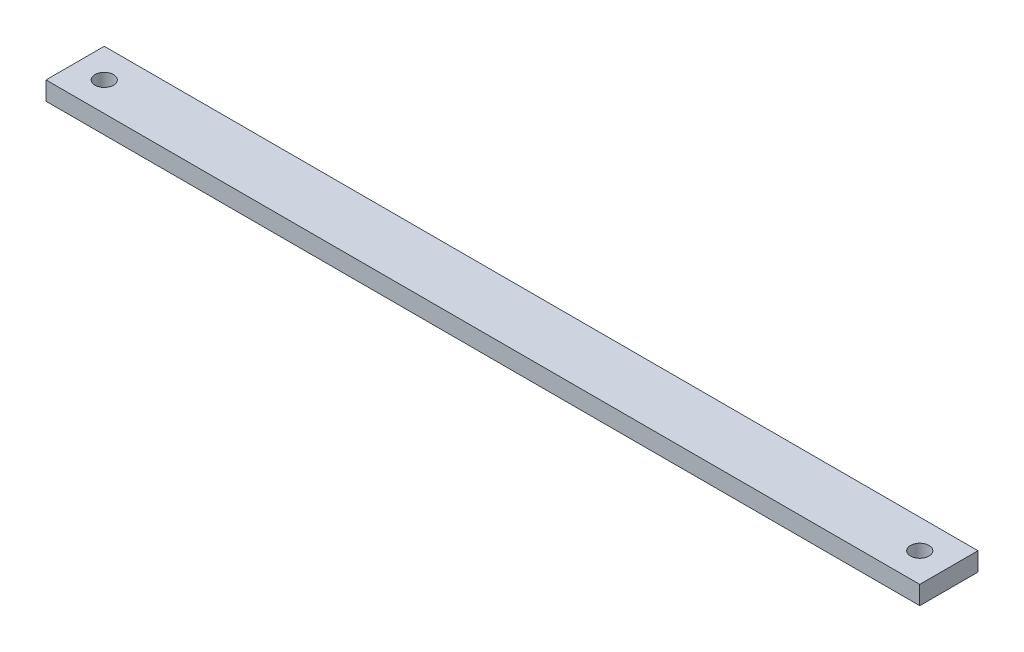
ISO-10303-21;
HEADER;
FILE_DESCRIPTION(('STEP AP214'),'2;1');
FILE_NAME('part.step','',(''),(''),'','','');
FILE_SCHEMA(('AUTOMOTIVE_DESIGN { 1 0 10303 214 1 1 1 1 }'));
ENDSEC;
DATA;
#1=APPLICATION_CONTEXT('core data for automotive mechanical design processes');
#2=APPLICATION_PROTOCOL_DEFINITION('international standard','automotive_design',2000,#1);
#3=PRODUCT_CONTEXT('',#1,'mechanical');
#4=PRODUCT('Part','Part','',(#3));
#5=PRODUCT_RELATED_PRODUCT_CATEGORY('part','',(#4));
#6=PRODUCT_DEFINITION_FORMATION('','',#4);
#7=PRODUCT_DEFINITION_CONTEXT('part definition',#1,'design');
#8=PRODUCT_DEFINITION('design','',#6,#7);
#9=PRODUCT_DEFINITION_SHAPE('','',#8);
#10=(LENGTH_UNIT() NAMED_UNIT(*) SI_UNIT(.MILLI.,.METRE.));
#11=(NAMED_UNIT(*) PLANE_ANGLE_UNIT() SI_UNIT($,.RADIAN.));
#12=(NAMED_UNIT(*) SI_UNIT($,.STERADIAN.) SOLID_ANGLE_UNIT());
#13=UNCERTAINTY_MEASURE_WITH_UNIT(LENGTH_MEASURE(1.E-05),#10,'distance_accuracy_value','');
#14=(GEOMETRIC_REPRESENTATION_CONTEXT(3) GLOBAL_UNCERTAINTY_ASSIGNED_CONTEXT((#13)) GLOBAL_UNIT_ASSIGNED_CONTEXT((#10,
#11,#12)) REPRESENTATION_CONTEXT('',''));
#15=CARTESIAN_POINT('',(0.,0.,0.));
#16=DIRECTION('',(0.,0.,1.));
#17=DIRECTION('',(1.,0.,0.));
#18=AXIS2_PLACEMENT_3D('',#15,#16,#17);
#19=CARTESIAN_POINT('',(-150.,6.35,-10.));
#20=DIRECTION('',(1.,0.,0.));
#21=DIRECTION('',(0.,0.,-1.));
#22=AXIS2_PLACEMENT_3D('',#19,#20,#21);
#23=PLANE('',#22);
#24=DIRECTION('',(0.,0.,1.));
#25=VECTOR('',#24,1.);
#26=CARTESIAN_POINT('',(-150.,0.,-10.));
#27=LINE('',#26,#25);
#28=CARTESIAN_POINT('',(-150.,0.,-10.));
#29=VERTEX_POINT('',#28);
#30=CARTESIAN_POINT('',(-150.,0.,10.));
#31=VERTEX_POINT('',#30);
#32=EDGE_CURVE('E96',#29,#31,#27,.T.);
#33=ORIENTED_EDGE('',*,*,#32,.T.);
#34=DIRECTION('',(0.,-1.,0.));
#35=VECTOR('',#34,1.);
#36=CARTESIAN_POINT('',(-150.,6.35,10.));
#37=LINE('',#36,#35);
#38=CARTESIAN_POINT('',(-150.,6.35,10.));
#39=VERTEX_POINT('',#38);
#40=EDGE_CURVE('E11',#39,#31,#37,.T.);
#41=ORIENTED_EDGE('',*,*,#40,.F.);
#42=DIRECTION('',(0.,0.,1.));
#43=VECTOR('',#42,1.);
#44=CARTESIAN_POINT('',(-150.,6.35,-10.));
#45=LINE('',#44,#43);
#46=CARTESIAN_POINT('',(-150.,6.35,-10.));
#47=VERTEX_POINT('',#46);
#48=EDGE_CURVE('E84',#47,#39,#45,.T.);
#49=ORIENTED_EDGE('',*,*,#48,.F.);
#50=DIRECTION('',(0.,-1.,0.));
#51=VECTOR('',#50,1.);
#52=CARTESIAN_POINT('',(-150.,6.35,-10.));
#53=LINE('',#52,#51);
#54=EDGE_CURVE('E92',#47,#29,#53,.T.);
#55=ORIENTED_EDGE('',*,*,#54,.T.);
#56=EDGE_LOOP('',(#33,#41,#49,#55));
#57=FACE_BOUND('',#56,.T.);
#58=ADVANCED_FACE('F33',(#57),#23,.F.);
#59=CARTESIAN_POINT('',(-150.,6.35,10.));
#60=DIRECTION('',(0.,0.,-1.));
#61=DIRECTION('',(-1.,0.,0.));
#62=AXIS2_PLACEMENT_3D('',#59,#60,#61);
#63=PLANE('',#62);
#64=DIRECTION('',(1.,0.,0.));
#65=VECTOR('',#64,1.);
#66=CARTESIAN_POINT('',(-150.,0.,10.));
#67=LINE('',#66,#65);
#68=CARTESIAN_POINT('',(150.,0.,10.));
#69=VERTEX_POINT('',#68);
#70=EDGE_CURVE('E88',#31,#69,#67,.T.);
#71=ORIENTED_EDGE('',*,*,#70,.T.);
#72=DIRECTION('',(0.,-1.,0.));
#73=VECTOR('',#72,1.);
#74=CARTESIAN_POINT('',(150.,6.35,10.));
#75=LINE('',#74,#73);
#76=CARTESIAN_POINT('',(150.,6.35,10.));
#77=VERTEX_POINT('',#76);
#78=EDGE_CURVE('E41',#77,#69,#75,.T.);
#79=ORIENTED_EDGE('',*,*,#78,.F.);
#80=DIRECTION('',(1.,0.,0.));
#81=VECTOR('',#80,1.);
#82=CARTESIAN_POINT('',(-150.,6.35,10.));
#83=LINE('',#82,#81);
#84=EDGE_CURVE('E79',#39,#77,#83,.T.);
#85=ORIENTED_EDGE('',*,*,#84,.F.);
#86=ORIENTED_EDGE('',*,*,#40,.T.);
#87=EDGE_LOOP('',(#71,#79,#85,#86));
#88=FACE_BOUND('',#87,.T.);
#89=ADVANCED_FACE('F87',(#88),#63,.F.);
#90=CARTESIAN_POINT('',(150.,6.35,-10.));
#91=DIRECTION('',(-1.,0.,0.));
#92=DIRECTION('',(0.,0.,1.));
#93=AXIS2_PLACEMENT_3D('',#90,#91,#92);
#94=PLANE('',#93);
#95=DIRECTION('',(0.,0.,-1.));
#96=VECTOR('',#95,1.);
#97=CARTESIAN_POINT('',(150.,0.,-10.));
#98=LINE('',#97,#96);
#99=CARTESIAN_POINT('',(150.,0.,-10.));
#100=VERTEX_POINT('',#99);
#101=EDGE_CURVE('E66',#69,#100,#98,.T.);
#102=ORIENTED_EDGE('',*,*,#101,.T.);
#103=DIRECTION('',(0.,-1.,0.));
#104=VECTOR('',#103,1.);
#105=CARTESIAN_POINT('',(150.,6.35,-10.));
#106=LINE('',#105,#104);
#107=CARTESIAN_POINT('',(150.,6.35,-10.));
#108=VERTEX_POINT('',#107);
#109=EDGE_CURVE('E89',#108,#100,#106,.T.);
#110=ORIENTED_EDGE('',*,*,#109,.F.);
#111=DIRECTION('',(0.,0.,-1.));
#112=VECTOR('',#111,1.);
#113=CARTESIAN_POINT('',(150.,6.35,-10.));
#114=LINE('',#113,#112);
#115=EDGE_CURVE('E82',#77,#108,#114,.T.);
#116=ORIENTED_EDGE('',*,*,#115,.F.);
#117=ORIENTED_EDGE('',*,*,#78,.T.);
#118=EDGE_LOOP('',(#102,#110,#116,#117));
#119=FACE_BOUND('',#118,.T.);
#120=ADVANCED_FACE('F90',(#119),#94,.F.);
#121=CARTESIAN_POINT('',(-150.,6.35,-10.));
#122=DIRECTION('',(0.,0.,1.));
#123=DIRECTION('',(1.,0.,0.));
#124=AXIS2_PLACEMENT_3D('',#121,#122,#123);
#125=PLANE('',#124);
#126=DIRECTION('',(-1.,0.,0.));
#127=VECTOR('',#126,1.);
#128=CARTESIAN_POINT('',(-150.,0.,-10.));
#129=LINE('',#128,#127);
#130=EDGE_CURVE('E72',#100,#29,#129,.T.);
#131=ORIENTED_EDGE('',*,*,#130,.T.);
#132=ORIENTED_EDGE('',*,*,#54,.F.);
#133=DIRECTION('',(-1.,0.,0.));
#134=VECTOR('',#133,1.);
#135=CARTESIAN_POINT('',(-150.,6.35,-10.));
#136=LINE('',#135,#134);
#137=EDGE_CURVE('E49',#108,#47,#136,.T.);
#138=ORIENTED_EDGE('',*,*,#137,.F.);
#139=ORIENTED_EDGE('',*,*,#109,.T.);
#140=EDGE_LOOP('',(#131,#132,#138,#139));
#141=FACE_BOUND('',#140,.T.);
#142=ADVANCED_FACE('F104',(#141),#125,.F.);
#143=CARTESIAN_POINT('',(0.,6.35,0.));
#144=DIRECTION('',(0.,1.,0.));
#145=DIRECTION('',(0.,0.,1.));
#146=AXIS2_PLACEMENT_3D('',#143,#144,#145);
#147=PLANE('',#146);
#148=CARTESIAN_POINT('',(140.,6.35,0.));
#149=DIRECTION('',(0.,1.,0.));
#150=DIRECTION('',(0.,0.,1.));
#151=AXIS2_PLACEMENT_3D('',#148,#149,#150);
#152=CIRCLE('',#151,3.175);
#153=CARTESIAN_POINT('',(140.,6.35,-3.175));
#154=VERTEX_POINT('',#153);
#155=EDGE_CURVE('E115',#154,#154,#152,.T.);
#156=ORIENTED_EDGE('',*,*,#155,.F.);
#157=EDGE_LOOP('',(#156));
#158=FACE_BOUND('',#157,.T.);
#159=CARTESIAN_POINT('',(-140.,6.35,0.));
#160=DIRECTION('',(0.,1.,0.));
#161=DIRECTION('',(0.,0.,1.));
#162=AXIS2_PLACEMENT_3D('',#159,#160,#161);
#163=CIRCLE('',#162,3.175);
#164=CARTESIAN_POINT('',(-140.,6.35,-3.175));
#165=VERTEX_POINT('',#164);
#166=EDGE_CURVE('E99',#165,#165,#163,.F.);
#167=ORIENTED_EDGE('',*,*,#166,.T.);
#168=EDGE_LOOP('',(#167));
#169=FACE_BOUND('',#168,.T.);
#170=ORIENTED_EDGE('',*,*,#48,.T.);
#171=ORIENTED_EDGE('',*,*,#84,.T.);
#172=ORIENTED_EDGE('',*,*,#115,.T.);
#173=ORIENTED_EDGE('',*,*,#137,.T.);
#174=EDGE_LOOP('',(#170,#171,#172,#173));
#175=FACE_BOUND('',#174,.T.);
#176=ADVANCED_FACE('F80',(#158,#169,#175),#147,.T.);
#177=CARTESIAN_POINT('',(0.,0.,0.));
#178=DIRECTION('',(0.,1.,0.));
#179=DIRECTION('',(0.,0.,1.));
#180=AXIS2_PLACEMENT_3D('',#177,#178,#179);
#181=PLANE('',#180);
#182=CARTESIAN_POINT('',(140.,0.,0.));
#183=DIRECTION('',(0.,1.,0.));
#184=DIRECTION('',(0.,0.,-1.));
#185=AXIS2_PLACEMENT_3D('',#182,#183,#184);
#186=CIRCLE('',#185,3.175);
#187=CARTESIAN_POINT('',(140.,0.,-3.175));
#188=VERTEX_POINT('',#187);
#189=EDGE_CURVE('E118',#188,#188,#186,.T.);
#190=ORIENTED_EDGE('',*,*,#189,.T.);
#191=EDGE_LOOP('',(#190));
#192=FACE_BOUND('',#191,.T.);
#193=CARTESIAN_POINT('',(-140.,0.,0.));
#194=DIRECTION('',(0.,-1.,0.));
#195=DIRECTION('',(0.,0.,-1.));
#196=AXIS2_PLACEMENT_3D('',#193,#194,#195);
#197=CIRCLE('',#196,3.175);
#198=CARTESIAN_POINT('',(-140.,0.,-3.175));
#199=VERTEX_POINT('',#198);
#200=EDGE_CURVE('E112',#199,#199,#197,.T.);
#201=ORIENTED_EDGE('',*,*,#200,.F.);
#202=EDGE_LOOP('',(#201));
#203=FACE_BOUND('',#202,.T.);
#204=ORIENTED_EDGE('',*,*,#32,.F.);
#205=ORIENTED_EDGE('',*,*,#130,.F.);
#206=ORIENTED_EDGE('',*,*,#101,.F.);
#207=ORIENTED_EDGE('',*,*,#70,.F.);
#208=EDGE_LOOP('',(#204,#205,#206,#207));
#209=FACE_BOUND('',#208,.T.);
#210=ADVANCED_FACE('F107',(#192,#203,#209),#181,.F.);
#211=CARTESIAN_POINT('',(-140.,15.3302561210692,0.));
#212=DIRECTION('',(0.,-1.,0.));
#213=DIRECTION('',(0.,0.,-1.));
#214=AXIS2_PLACEMENT_3D('',#211,#212,#213);
#215=CYLINDRICAL_SURFACE('',#214,3.175);
#216=CARTESIAN_POINT('',(-140.,0.,-3.175));
#217=CARTESIAN_POINT('',(-140.,0.0661458333333336,-3.175));
#218=CARTESIAN_POINT('',(-140.,0.132291666666667,-3.175));
#219=CARTESIAN_POINT('',(-140.,0.264583333333334,-3.175));
#220=CARTESIAN_POINT('',(-140.,0.330729166666667,-3.175));
#221=CARTESIAN_POINT('',(-140.,0.463020833333333,-3.175));
#222=CARTESIAN_POINT('',(-140.,0.529166666666667,-3.175));
#223=CARTESIAN_POINT('',(-140.,0.661458333333333,-3.175));
#224=CARTESIAN_POINT('',(-140.,0.727604166666666,-3.175));
#225=CARTESIAN_POINT('',(-140.,0.859895833333333,-3.175));
#226=CARTESIAN_POINT('',(-140.,0.926041666666666,-3.175));
#227=CARTESIAN_POINT('',(-140.,1.05833333333333,-3.175));
#228=CARTESIAN_POINT('',(-140.,1.12447916666667,-3.175));
#229=CARTESIAN_POINT('',(-140.,1.25677083333333,-3.175));
#230=CARTESIAN_POINT('',(-140.,1.32291666666667,-3.175));
#231=CARTESIAN_POINT('',(-140.,1.45520833333333,-3.175));
#232=CARTESIAN_POINT('',(-140.,1.52135416666667,-3.175));
#233=CARTESIAN_POINT('',(-140.,1.65364583333333,-3.175));
#234=CARTESIAN_POINT('',(-140.,1.71979166666667,-3.175));
#235=CARTESIAN_POINT('',(-140.,1.85208333333333,-3.175));
#236=CARTESIAN_POINT('',(-140.,1.91822916666667,-3.175));
#237=CARTESIAN_POINT('',(-140.,2.05052083333333,-3.175));
#238=CARTESIAN_POINT('',(-140.,2.11666666666667,-3.175));
#239=CARTESIAN_POINT('',(-140.,2.24895833333333,-3.175));
#240=CARTESIAN_POINT('',(-140.,2.31510416666667,-3.175));
#241=CARTESIAN_POINT('',(-140.,2.44739583333333,-3.175));
#242=CARTESIAN_POINT('',(-140.,2.51354166666667,-3.175));
#243=CARTESIAN_POINT('',(-140.,2.64583333333333,-3.175));
#244=CARTESIAN_POINT('',(-140.,2.71197916666667,-3.175));
#245=CARTESIAN_POINT('',(-140.,2.84427083333333,-3.175));
#246=CARTESIAN_POINT('',(-140.,2.91041666666667,-3.175));
#247=CARTESIAN_POINT('',(-140.,3.04270833333333,-3.175));
#248=CARTESIAN_POINT('',(-140.,3.10885416666667,-3.175));
#249=CARTESIAN_POINT('',(-140.,3.24114583333333,-3.175));
#250=CARTESIAN_POINT('',(-140.,3.30729166666667,-3.175));
#251=CARTESIAN_POINT('',(-140.,3.43958333333333,-3.175));
#252=CARTESIAN_POINT('',(-140.,3.50572916666667,-3.175));
#253=CARTESIAN_POINT('',(-140.,3.63802083333333,-3.175));
#254=CARTESIAN_POINT('',(-140.,3.70416666666667,-3.175));
#255=CARTESIAN_POINT('',(-140.,3.83645833333333,-3.175));
#256=CARTESIAN_POINT('',(-140.,3.90260416666667,-3.175));
#257=CARTESIAN_POINT('',(-140.,4.03489583333333,-3.175));
#258=CARTESIAN_POINT('',(-140.,4.10104166666667,-3.175));
#259=CARTESIAN_POINT('',(-140.,4.23333333333333,-3.175));
#260=CARTESIAN_POINT('',(-140.,4.29947916666667,-3.175));
#261=CARTESIAN_POINT('',(-140.,4.43177083333333,-3.175));
#262=CARTESIAN_POINT('',(-140.,4.49791666666667,-3.175));
#263=CARTESIAN_POINT('',(-140.,4.63020833333333,-3.175));
#264=CARTESIAN_POINT('',(-140.,4.69635416666667,-3.175));
#265=CARTESIAN_POINT('',(-140.,4.82864583333333,-3.175));
#266=CARTESIAN_POINT('',(-140.,4.89479166666667,-3.175));
#267=CARTESIAN_POINT('',(-140.,5.02708333333333,-3.175));
#268=CARTESIAN_POINT('',(-140.,5.09322916666666,-3.175));
#269=CARTESIAN_POINT('',(-140.,5.22552083333333,-3.175));
#270=CARTESIAN_POINT('',(-140.,5.29166666666666,-3.175));
#271=CARTESIAN_POINT('',(-140.,5.42395833333333,-3.175));
#272=CARTESIAN_POINT('',(-140.,5.49010416666667,-3.175));
#273=CARTESIAN_POINT('',(-140.,5.62239583333333,-3.175));
#274=CARTESIAN_POINT('',(-140.,5.68854166666666,-3.175));
#275=CARTESIAN_POINT('',(-140.,5.82083333333333,-3.175));
#276=CARTESIAN_POINT('',(-140.,5.88697916666666,-3.175));
#277=CARTESIAN_POINT('',(-140.,6.01927083333333,-3.175));
#278=CARTESIAN_POINT('',(-140.,6.08541666666667,-3.175));
#279=CARTESIAN_POINT('',(-140.,6.21770833333333,-3.175));
#280=CARTESIAN_POINT('',(-140.,6.28385416666667,-3.175));
#281=CARTESIAN_POINT('',(-140.,6.35,-3.175));
#282=B_SPLINE_CURVE_WITH_KNOTS('',3,(#216,#217,#218,#219,#220,#221,#222,#223,#224,#225,#226,
#227,#228,#229,#230,#231,#232,#233,#234,#235,#236,#237,#238,#239,#240,#241,#242,#243,#244,#245,
#246,#247,#248,#249,#250,#251,#252,#253,#254,#255,#256,#257,#258,#259,#260,#261,#262,#263,#264,
#265,#266,#267,#268,#269,#270,#271,#272,#273,#274,#275,#276,#277,#278,#279,#280,#281),
.UNSPECIFIED.,.F.,.F.,(4,2,2,2,2,2,2,2,2,2,2,2,2,2,2,2,2,2,2,2,2,2,2,2,2,2,2,2,2,2,2,2,4),(0.,
0.198437500000001,0.396875,0.5953125,0.793749999999999,0.9921875,1.190625,1.3890625,1.5875,
1.7859375,1.984375,2.1828125,2.38125,2.5796875,2.778125,2.9765625,3.175,3.3734375,3.571875,
3.7703125,3.96875,4.1671875,4.365625,4.5640625,4.7625,4.9609375,5.159375,5.3578125,5.55625,
5.7546875,5.953125,6.1515625,6.35),.UNSPECIFIED.);
#283=EDGE_CURVE('BSEAM127',#199,#165,#282,.T.);
#284=ORIENTED_EDGE('',*,*,#200,.T.);
#285=ORIENTED_EDGE('',*,*,#166,.F.);
#286=ORIENTED_EDGE('',*,*,#283,.T.);
#287=ORIENTED_EDGE('',*,*,#283,.F.);
#288=EDGE_LOOP('',(#284,#286,#285,#287));
#289=FACE_BOUND('',#288,.T.);
#290=ADVANCED_FACE('F127',(#289),#215,.F.);
#291=CARTESIAN_POINT('',(140.,15.3302561210692,0.));
#292=DIRECTION('',(0.,-1.,0.));
#293=DIRECTION('',(0.,0.,-1.));
#294=AXIS2_PLACEMENT_3D('',#291,#292,#293);
#295=CYLINDRICAL_SURFACE('',#294,3.175);
#296=CARTESIAN_POINT('',(140.,0.,-3.175));
#297=CARTESIAN_POINT('',(140.,0.0661458333333336,-3.175));
#298=CARTESIAN_POINT('',(140.,0.132291666666667,-3.175));
#299=CARTESIAN_POINT('',(140.,0.264583333333334,-3.175));
#300=CARTESIAN_POINT('',(140.,0.330729166666667,-3.175));
#301=CARTESIAN_POINT('',(140.,0.463020833333333,-3.175));
#302=CARTESIAN_POINT('',(140.,0.529166666666667,-3.175));
#303=CARTESIAN_POINT('',(140.,0.661458333333333,-3.175));
#304=CARTESIAN_POINT('',(140.,0.727604166666666,-3.175));
#305=CARTESIAN_POINT('',(140.,0.859895833333333,-3.175));
#306=CARTESIAN_POINT('',(140.,0.926041666666666,-3.175));
#307=CARTESIAN_POINT('',(140.,1.05833333333333,-3.175));
#308=CARTESIAN_POINT('',(140.,1.12447916666667,-3.175));
#309=CARTESIAN_POINT('',(140.,1.25677083333333,-3.175));
#310=CARTESIAN_POINT('',(140.,1.32291666666667,-3.175));
#311=CARTESIAN_POINT('',(140.,1.45520833333333,-3.175));
#312=CARTESIAN_POINT('',(140.,1.52135416666667,-3.175));
#313=CARTESIAN_POINT('',(140.,1.65364583333333,-3.175));
#314=CARTESIAN_POINT('',(140.,1.71979166666667,-3.175));
#315=CARTESIAN_POINT('',(140.,1.85208333333333,-3.175));
#316=CARTESIAN_POINT('',(140.,1.91822916666667,-3.175));
#317=CARTESIAN_POINT('',(140.,2.05052083333333,-3.175));
#318=CARTESIAN_POINT('',(140.,2.11666666666667,-3.175));
#319=CARTESIAN_POINT('',(140.,2.24895833333333,-3.175));
#320=CARTESIAN_POINT('',(140.,2.31510416666667,-3.175));
#321=CARTESIAN_POINT('',(140.,2.44739583333333,-3.175));
#322=CARTESIAN_POINT('',(140.,2.51354166666667,-3.175));
#323=CARTESIAN_POINT('',(140.,2.64583333333333,-3.175));
#324=CARTESIAN_POINT('',(140.,2.71197916666667,-3.175));
#325=CARTESIAN_POINT('',(140.,2.84427083333333,-3.175));
#326=CARTESIAN_POINT('',(140.,2.91041666666667,-3.175));
#327=CARTESIAN_POINT('',(140.,3.04270833333333,-3.175));
#328=CARTESIAN_POINT('',(140.,3.10885416666667,-3.175));
#329=CARTESIAN_POINT('',(140.,3.24114583333333,-3.175));
#330=CARTESIAN_POINT('',(140.,3.30729166666667,-3.175));
#331=CARTESIAN_POINT('',(140.,3.43958333333333,-3.175));
#332=CARTESIAN_POINT('',(140.,3.50572916666667,-3.175));
#333=CARTESIAN_POINT('',(140.,3.63802083333333,-3.175));
#334=CARTESIAN_POINT('',(140.,3.70416666666667,-3.175));
#335=CARTESIAN_POINT('',(140.,3.83645833333333,-3.175));
#336=CARTESIAN_POINT('',(140.,3.90260416666667,-3.175));
#337=CARTESIAN_POINT('',(140.,4.03489583333333,-3.175));
#338=CARTESIAN_POINT('',(140.,4.10104166666667,-3.175));
#339=CARTESIAN_POINT('',(140.,4.23333333333333,-3.175));
#340=CARTESIAN_POINT('',(140.,4.29947916666667,-3.175));
#341=CARTESIAN_POINT('',(140.,4.43177083333333,-3.175));
#342=CARTESIAN_POINT('',(140.,4.49791666666667,-3.175));
#343=CARTESIAN_POINT('',(140.,4.63020833333333,-3.175));
#344=CARTESIAN_POINT('',(140.,4.69635416666667,-3.175));
#345=CARTESIAN_POINT('',(140.,4.82864583333333,-3.175));
#346=CARTESIAN_POINT('',(140.,4.89479166666667,-3.175));
#347=CARTESIAN_POINT('',(140.,5.02708333333333,-3.175));
#348=CARTESIAN_POINT('',(140.,5.09322916666666,-3.175));
#349=CARTESIAN_POINT('',(140.,5.22552083333333,-3.175));
#350=CARTESIAN_POINT('',(140.,5.29166666666666,-3.175));
#351=CARTESIAN_POINT('',(140.,5.42395833333333,-3.175));
#352=CARTESIAN_POINT('',(140.,5.49010416666667,-3.175));
#353=CARTESIAN_POINT('',(140.,5.62239583333333,-3.175));
#354=CARTESIAN_POINT('',(140.,5.68854166666666,-3.175));
#355=CARTESIAN_POINT('',(140.,5.82083333333333,-3.175));
#356=CARTESIAN_POINT('',(140.,5.88697916666666,-3.175));
#357=CARTESIAN_POINT('',(140.,6.01927083333333,-3.175));
#358=CARTESIAN_POINT('',(140.,6.08541666666667,-3.175));
#359=CARTESIAN_POINT('',(140.,6.21770833333333,-3.175));
#360=CARTESIAN_POINT('',(140.,6.28385416666667,-3.175));
#361=CARTESIAN_POINT('',(140.,6.35,-3.175));
#362=B_SPLINE_CURVE_WITH_KNOTS('',3,(#296,#297,#298,#299,#300,#301,#302,#303,#304,#305,#306,
#307,#308,#309,#310,#311,#312,#313,#314,#315,#316,#317,#318,#319,#320,#321,#322,#323,#324,#325,
#326,#327,#328,#329,#330,#331,#332,#333,#334,#335,#336,#337,#338,#339,#340,#341,#342,#343,#344,
#345,#346,#347,#348,#349,#350,#351,#352,#353,#354,#355,#356,#357,#358,#359,#360,#361),
.UNSPECIFIED.,.F.,.F.,(4,2,2,2,2,2,2,2,2,2,2,2,2,2,2,2,2,2,2,2,2,2,2,2,2,2,2,2,2,2,2,2,4),(0.,
0.198437500000001,0.396875,0.5953125,0.793749999999999,0.9921875,1.190625,1.3890625,1.5875,
1.7859375,1.984375,2.1828125,2.38125,2.5796875,2.778125,2.9765625,3.175,3.3734375,3.571875,
3.7703125,3.96875,4.1671875,4.365625,4.5640625,4.7625,4.9609375,5.159375,5.3578125,5.55625,
5.7546875,5.953125,6.1515625,6.35),.UNSPECIFIED.);
#363=EDGE_CURVE('BSEAM124',#188,#154,#362,.T.);
#364=ORIENTED_EDGE('',*,*,#189,.F.);
#365=ORIENTED_EDGE('',*,*,#155,.T.);
#366=ORIENTED_EDGE('',*,*,#363,.T.);
#367=ORIENTED_EDGE('',*,*,#363,.F.);
#368=EDGE_LOOP('',(#364,#366,#365,#367));
#369=FACE_BOUND('',#368,.T.);
#370=ADVANCED_FACE('F124',(#369),#295,.F.);
#371=CLOSED_SHELL('',(#58,#89,#120,#142,#176,#210,#290,#370));
#372=MANIFOLD_SOLID_BREP('B2',#371);
#373=ADVANCED_BREP_SHAPE_REPRESENTATION('',(#18,#372),#14);
#374=SHAPE_DEFINITION_REPRESENTATION(#9,#373);
ENDSEC;
END-ISO-10303-21;
